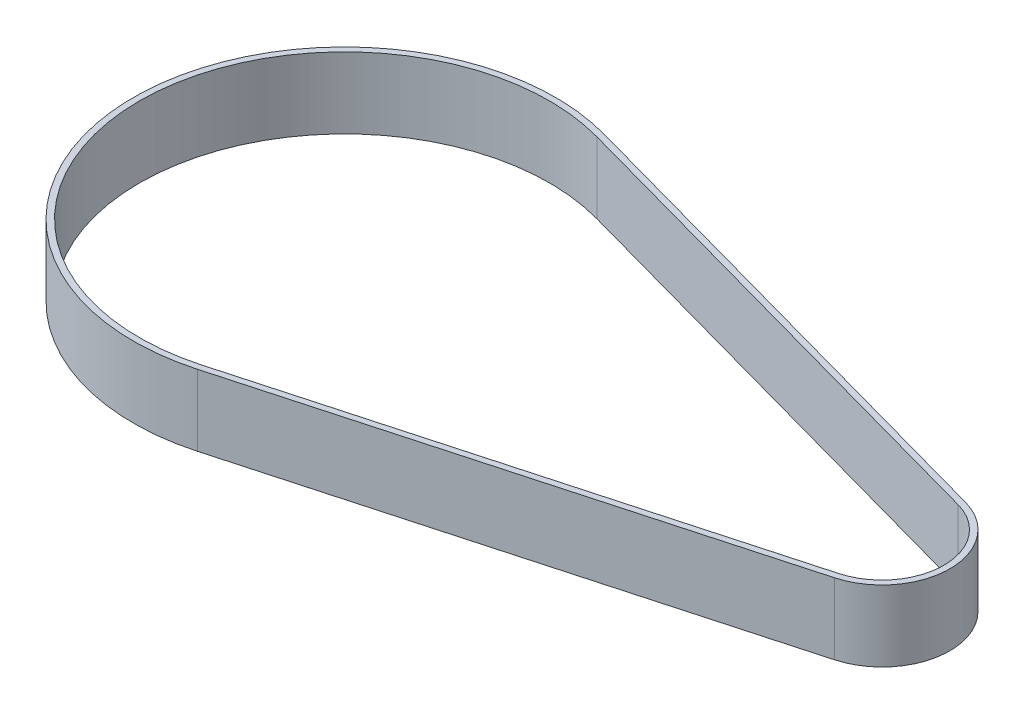
ISO-10303-21;
HEADER;
FILE_DESCRIPTION(('STEP AP214'),'2;1');
FILE_NAME('part.step','',(''),(''),'','','');
FILE_SCHEMA(('AUTOMOTIVE_DESIGN { 1 0 10303 214 1 1 1 1 }'));
ENDSEC;
DATA;
#1=APPLICATION_CONTEXT('core data for automotive mechanical design processes');
#2=APPLICATION_PROTOCOL_DEFINITION('international standard','automotive_design',2000,#1);
#3=PRODUCT_CONTEXT('',#1,'mechanical');
#4=PRODUCT('Part','Part','',(#3));
#5=PRODUCT_RELATED_PRODUCT_CATEGORY('part','',(#4));
#6=PRODUCT_DEFINITION_FORMATION('','',#4);
#7=PRODUCT_DEFINITION_CONTEXT('part definition',#1,'design');
#8=PRODUCT_DEFINITION('design','',#6,#7);
#9=PRODUCT_DEFINITION_SHAPE('','',#8);
#10=(LENGTH_UNIT() NAMED_UNIT(*) SI_UNIT(.MILLI.,.METRE.));
#11=(NAMED_UNIT(*) PLANE_ANGLE_UNIT() SI_UNIT($,.RADIAN.));
#12=(NAMED_UNIT(*) SI_UNIT($,.STERADIAN.) SOLID_ANGLE_UNIT());
#13=UNCERTAINTY_MEASURE_WITH_UNIT(LENGTH_MEASURE(1.E-05),#10,'distance_accuracy_value','');
#14=(GEOMETRIC_REPRESENTATION_CONTEXT(3) GLOBAL_UNCERTAINTY_ASSIGNED_CONTEXT((#13)) GLOBAL_UNIT_ASSIGNED_CONTEXT((#10,
#11,#12)) REPRESENTATION_CONTEXT('',''));
#15=CARTESIAN_POINT('',(0.,0.,0.));
#16=DIRECTION('',(0.,0.,1.));
#17=DIRECTION('',(1.,0.,0.));
#18=AXIS2_PLACEMENT_3D('',#15,#16,#17);
#19=CARTESIAN_POINT('',(11.8754505041929,15.,-42.939710500683));
#20=DIRECTION('',(-0.266436558043237,0.,0.963852457867942));
#21=DIRECTION('',(0.963852457867942,0.,0.266436558043237));
#22=AXIS2_PLACEMENT_3D('',#19,#20,#21);
#23=PLANE('',#22);
#24=DIRECTION('',(0.,-1.,0.));
#25=VECTOR('',#24,1.);
#26=CARTESIAN_POINT('',(11.8754505041929,15.,-42.939710500683));
#27=LINE('',#26,#25);
#28=CARTESIAN_POINT('',(11.8754505041929,15.,-42.939710500683));
#29=VERTEX_POINT('',#28);
#30=CARTESIAN_POINT('',(11.8754505041929,0.,-42.939710500683));
#31=VERTEX_POINT('',#30);
#32=EDGE_CURVE('E98',#29,#31,#27,.T.);
#33=ORIENTED_EDGE('',*,*,#32,.F.);
#34=DIRECTION('',(-0.963852457867942,0.,-0.266436558043237));
#35=VECTOR('',#34,1.);
#36=CARTESIAN_POINT('',(117.262255155904,15.,-13.807764770433));
#37=LINE('',#36,#35);
#38=CARTESIAN_POINT('',(117.262255155904,15.,-13.807764770433));
#39=VERTEX_POINT('',#38);
#40=EDGE_CURVE('E96',#39,#29,#37,.T.);
#41=ORIENTED_EDGE('',*,*,#40,.F.);
#42=DIRECTION('',(0.,-1.,0.));
#43=VECTOR('',#42,1.);
#44=CARTESIAN_POINT('',(117.262255155904,15.,-13.807764770433));
#45=LINE('',#44,#43);
#46=CARTESIAN_POINT('',(117.262255155904,0.,-13.807764770433));
#47=VERTEX_POINT('',#46);
#48=EDGE_CURVE('E83',#47,#39,#45,.F.);
#49=ORIENTED_EDGE('',*,*,#48,.F.);
#50=DIRECTION('',(-0.963852457867942,0.,-0.266436558043237));
#51=VECTOR('',#50,1.);
#52=CARTESIAN_POINT('',(117.262255155904,0.,-13.807764770433));
#53=LINE('',#52,#51);
#54=EDGE_CURVE('E114',#47,#31,#53,.T.);
#55=ORIENTED_EDGE('',*,*,#54,.T.);
#56=EDGE_LOOP('',(#33,#41,#49,#55));
#57=FACE_BOUND('',#56,.T.);
#58=ADVANCED_FACE('F17',(#57),#23,.F.);
#59=CARTESIAN_POINT('',(11.8754505041929,15.,42.939710500683));
#60=DIRECTION('',(-0.266436558043237,0.,-0.963852457867942));
#61=DIRECTION('',(-0.963852457867942,0.,0.266436558043237));
#62=AXIS2_PLACEMENT_3D('',#59,#60,#61);
#63=PLANE('',#62);
#64=DIRECTION('',(0.,-1.,0.));
#65=VECTOR('',#64,1.);
#66=CARTESIAN_POINT('',(117.262255155904,15.,13.807764770433));
#67=LINE('',#66,#65);
#68=CARTESIAN_POINT('',(117.262255155904,15.,13.807764770433));
#69=VERTEX_POINT('',#68);
#70=CARTESIAN_POINT('',(117.262255155904,0.,13.807764770433));
#71=VERTEX_POINT('',#70);
#72=EDGE_CURVE('E78',#69,#71,#67,.T.);
#73=ORIENTED_EDGE('',*,*,#72,.F.);
#74=DIRECTION('',(0.963852457867942,0.,-0.266436558043237));
#75=VECTOR('',#74,1.);
#76=CARTESIAN_POINT('',(11.8754505041929,15.,42.939710500683));
#77=LINE('',#76,#75);
#78=CARTESIAN_POINT('',(11.8754505041929,15.,42.939710500683));
#79=VERTEX_POINT('',#78);
#80=EDGE_CURVE('E100',#79,#69,#77,.T.);
#81=ORIENTED_EDGE('',*,*,#80,.F.);
#82=DIRECTION('',(0.,-1.,0.));
#83=VECTOR('',#82,1.);
#84=CARTESIAN_POINT('',(11.8754505041929,15.,42.939710500683));
#85=LINE('',#84,#83);
#86=CARTESIAN_POINT('',(11.8754505041929,0.,42.939710500683));
#87=VERTEX_POINT('',#86);
#88=EDGE_CURVE('E103',#87,#79,#85,.F.);
#89=ORIENTED_EDGE('',*,*,#88,.F.);
#90=DIRECTION('',(0.963852457867942,0.,-0.266436558043237));
#91=VECTOR('',#90,1.);
#92=CARTESIAN_POINT('',(11.8754505041929,0.,42.939710500683));
#93=LINE('',#92,#91);
#94=EDGE_CURVE('E124',#87,#71,#93,.T.);
#95=ORIENTED_EDGE('',*,*,#94,.T.);
#96=EDGE_LOOP('',(#73,#81,#89,#95));
#97=FACE_BOUND('',#96,.T.);
#98=ADVANCED_FACE('F184',(#97),#63,.F.);
#99=CARTESIAN_POINT('',(113.4453916,15.,0.));
#100=DIRECTION('',(0.,-1.,0.));
#101=DIRECTION('',(0.,0.,-1.));
#102=AXIS2_PLACEMENT_3D('',#99,#100,#101);
#103=CYLINDRICAL_SURFACE('',#102,14.3256);
#104=CARTESIAN_POINT('',(113.4453916,15.,0.));
#105=DIRECTION('',(0.,-1.,0.));
#106=DIRECTION('',(0.,0.,-1.));
#107=AXIS2_PLACEMENT_3D('',#104,#105,#106);
#108=CIRCLE('',#107,14.3256);
#109=EDGE_CURVE('E20',#69,#39,#108,.F.);
#110=ORIENTED_EDGE('',*,*,#109,.F.);
#111=ORIENTED_EDGE('',*,*,#72,.T.);
#112=CARTESIAN_POINT('',(113.4453916,0.,0.));
#113=DIRECTION('',(0.,-1.,0.));
#114=DIRECTION('',(0.,0.,-1.));
#115=AXIS2_PLACEMENT_3D('',#112,#113,#114);
#116=CIRCLE('',#115,14.3256);
#117=EDGE_CURVE('E89',#71,#47,#116,.F.);
#118=ORIENTED_EDGE('',*,*,#117,.T.);
#119=ORIENTED_EDGE('',*,*,#48,.T.);
#120=EDGE_LOOP('',(#110,#111,#118,#119));
#121=FACE_BOUND('',#120,.T.);
#122=ADVANCED_FACE('F85',(#121),#103,.T.);
#123=CARTESIAN_POINT('',(11.5370008824211,15.,-41.7156386696877));
#124=DIRECTION('',(-0.266436558085482,0.,0.963852457856264));
#125=DIRECTION('',(0.963852457856264,0.,0.266436558085482));
#126=AXIS2_PLACEMENT_3D('',#123,#124,#125);
#127=PLANE('',#126);
#128=DIRECTION('',(0.963852457856264,0.,0.266436558085482));
#129=VECTOR('',#128,1.);
#130=CARTESIAN_POINT('',(11.5370008824211,15.,-41.7156386696877));
#131=LINE('',#130,#129);
#132=CARTESIAN_POINT('',(11.5370008824211,15.,-41.7156386696877));
#133=VERTEX_POINT('',#132);
#134=CARTESIAN_POINT('',(116.923880727465,15.,-12.5836721488645));
#135=VERTEX_POINT('',#134);
#136=EDGE_CURVE('E126',#133,#135,#131,.T.);
#137=ORIENTED_EDGE('',*,*,#136,.F.);
#138=DIRECTION('',(0.,-1.,0.));
#139=VECTOR('',#138,1.);
#140=CARTESIAN_POINT('',(11.5370008824211,15.,-41.7156386696877));
#141=LINE('',#140,#139);
#142=CARTESIAN_POINT('',(11.5370008824211,0.,-41.7156386696877));
#143=VERTEX_POINT('',#142);
#144=EDGE_CURVE('E105',#133,#143,#141,.T.);
#145=ORIENTED_EDGE('',*,*,#144,.T.);
#146=DIRECTION('',(0.963852457856264,0.,0.266436558085482));
#147=VECTOR('',#146,1.);
#148=CARTESIAN_POINT('',(11.5370008824211,0.,-41.7156386696877));
#149=LINE('',#148,#147);
#150=CARTESIAN_POINT('',(116.923880727465,0.,-12.5836721488645));
#151=VERTEX_POINT('',#150);
#152=EDGE_CURVE('E122',#143,#151,#149,.T.);
#153=ORIENTED_EDGE('',*,*,#152,.T.);
#154=DIRECTION('',(0.,-1.,0.));
#155=VECTOR('',#154,1.);
#156=CARTESIAN_POINT('',(116.923880727189,15.,-12.5836721489407));
#157=LINE('',#156,#155);
#158=EDGE_CURVE('E144',#151,#135,#157,.F.);
#159=ORIENTED_EDGE('',*,*,#158,.T.);
#160=EDGE_LOOP('',(#137,#145,#153,#159));
#161=FACE_BOUND('',#160,.T.);
#162=ADVANCED_FACE('F159',(#161),#127,.T.);
#163=CARTESIAN_POINT('',(113.4453916,15.,0.));
#164=DIRECTION('',(0.,-1.,0.));
#165=DIRECTION('',(0.,0.,-1.));
#166=AXIS2_PLACEMENT_3D('',#163,#164,#165);
#167=CYLINDRICAL_SURFACE('',#166,13.0556);
#168=DIRECTION('',(0.,1.,0.));
#169=VECTOR('',#168,1.);
#170=CARTESIAN_POINT('',(116.923880727189,15.,12.5836721489407));
#171=LINE('',#170,#169);
#172=CARTESIAN_POINT('',(116.923880727465,15.,12.5836721488645));
#173=VERTEX_POINT('',#172);
#174=CARTESIAN_POINT('',(116.923880727465,0.,12.5836721488645));
#175=VERTEX_POINT('',#174);
#176=EDGE_CURVE('E141',#173,#175,#171,.F.);
#177=ORIENTED_EDGE('',*,*,#176,.F.);
#178=CARTESIAN_POINT('',(113.4453916,15.,0.));
#179=DIRECTION('',(0.,-1.,0.));
#180=DIRECTION('',(0.,0.,-1.));
#181=AXIS2_PLACEMENT_3D('',#178,#179,#180);
#182=CIRCLE('',#181,13.0556);
#183=EDGE_CURVE('E115',#135,#173,#182,.T.);
#184=ORIENTED_EDGE('',*,*,#183,.F.);
#185=ORIENTED_EDGE('',*,*,#158,.F.);
#186=CARTESIAN_POINT('',(113.4453916,0.,0.));
#187=DIRECTION('',(0.,-1.,0.));
#188=DIRECTION('',(0.,0.,-1.));
#189=AXIS2_PLACEMENT_3D('',#186,#187,#188);
#190=CIRCLE('',#189,13.0556);
#191=EDGE_CURVE('E120',#151,#175,#190,.T.);
#192=ORIENTED_EDGE('',*,*,#191,.T.);
#193=EDGE_LOOP('',(#177,#184,#185,#192));
#194=FACE_BOUND('',#193,.T.);
#195=ADVANCED_FACE('F163',(#194),#167,.F.);
#196=CARTESIAN_POINT('',(11.5370008824211,15.,41.7156386696877));
#197=DIRECTION('',(-0.266436558085482,0.,-0.963852457856264));
#198=DIRECTION('',(-0.963852457856264,0.,0.266436558085482));
#199=AXIS2_PLACEMENT_3D('',#196,#197,#198);
#200=PLANE('',#199);
#201=DIRECTION('',(-0.963852457856264,0.,0.266436558085482));
#202=VECTOR('',#201,1.);
#203=CARTESIAN_POINT('',(116.923880727189,15.,12.5836721489407));
#204=LINE('',#203,#202);
#205=CARTESIAN_POINT('',(11.5370008824211,15.,41.7156386696877));
#206=VERTEX_POINT('',#205);
#207=EDGE_CURVE('E129',#173,#206,#204,.T.);
#208=ORIENTED_EDGE('',*,*,#207,.F.);
#209=ORIENTED_EDGE('',*,*,#176,.T.);
#210=DIRECTION('',(-0.963852457856264,0.,0.266436558085482));
#211=VECTOR('',#210,1.);
#212=CARTESIAN_POINT('',(116.923880727189,0.,12.5836721489407));
#213=LINE('',#212,#211);
#214=CARTESIAN_POINT('',(11.5370008824211,0.,41.7156386696877));
#215=VERTEX_POINT('',#214);
#216=EDGE_CURVE('E119',#175,#215,#213,.T.);
#217=ORIENTED_EDGE('',*,*,#216,.T.);
#218=DIRECTION('',(0.,-1.,0.));
#219=VECTOR('',#218,1.);
#220=CARTESIAN_POINT('',(11.5370008824211,15.,41.7156386696877));
#221=LINE('',#220,#219);
#222=EDGE_CURVE('E110',#215,#206,#221,.F.);
#223=ORIENTED_EDGE('',*,*,#222,.T.);
#224=EDGE_LOOP('',(#208,#209,#217,#223));
#225=FACE_BOUND('',#224,.T.);
#226=ADVANCED_FACE('F153',(#225),#200,.T.);
#227=CARTESIAN_POINT('',(0.,15.,0.));
#228=DIRECTION('',(0.,-1.,0.));
#229=DIRECTION('',(0.,0.,-1.));
#230=AXIS2_PLACEMENT_3D('',#227,#228,#229);
#231=CYLINDRICAL_SURFACE('',#230,43.2816000048626);
#232=CARTESIAN_POINT('',(0.,15.,0.));
#233=DIRECTION('',(0.,-1.,0.));
#234=DIRECTION('',(0.,0.,-1.));
#235=AXIS2_PLACEMENT_3D('',#232,#233,#234);
#236=CIRCLE('',#235,43.2816000048626);
#237=EDGE_CURVE('E127',#206,#133,#236,.T.);
#238=ORIENTED_EDGE('',*,*,#237,.F.);
#239=ORIENTED_EDGE('',*,*,#222,.F.);
#240=CARTESIAN_POINT('',(0.,0.,0.));
#241=DIRECTION('',(0.,-1.,0.));
#242=DIRECTION('',(0.,0.,-1.));
#243=AXIS2_PLACEMENT_3D('',#240,#241,#242);
#244=CIRCLE('',#243,43.2816000048626);
#245=EDGE_CURVE('E35',#215,#143,#244,.T.);
#246=ORIENTED_EDGE('',*,*,#245,.T.);
#247=ORIENTED_EDGE('',*,*,#144,.F.);
#248=EDGE_LOOP('',(#238,#239,#246,#247));
#249=FACE_BOUND('',#248,.T.);
#250=ADVANCED_FACE('F156',(#249),#231,.F.);
#251=CARTESIAN_POINT('',(113.4453916,15.,0.));
#252=DIRECTION('',(0.,1.,0.));
#253=DIRECTION('',(0.,0.,1.));
#254=AXIS2_PLACEMENT_3D('',#251,#252,#253);
#255=PLANE('',#254);
#256=ORIENTED_EDGE('',*,*,#136,.T.);
#257=ORIENTED_EDGE('',*,*,#183,.T.);
#258=ORIENTED_EDGE('',*,*,#207,.T.);
#259=ORIENTED_EDGE('',*,*,#237,.T.);
#260=EDGE_LOOP('',(#256,#257,#258,#259));
#261=FACE_BOUND('',#260,.T.);
#262=CARTESIAN_POINT('',(0.,15.,0.));
#263=DIRECTION('',(0.,-1.,0.));
#264=DIRECTION('',(0.,0.,-1.));
#265=AXIS2_PLACEMENT_3D('',#262,#263,#264);
#266=CIRCLE('',#265,44.5516);
#267=EDGE_CURVE('E26',#79,#29,#266,.T.);
#268=ORIENTED_EDGE('',*,*,#267,.F.);
#269=ORIENTED_EDGE('',*,*,#80,.T.);
#270=ORIENTED_EDGE('',*,*,#109,.T.);
#271=ORIENTED_EDGE('',*,*,#40,.T.);
#272=EDGE_LOOP('',(#268,#269,#270,#271));
#273=FACE_BOUND('',#272,.T.);
#274=ADVANCED_FACE('F102',(#261,#273),#255,.T.);
#275=CARTESIAN_POINT('',(113.4453916,0.,0.));
#276=DIRECTION('',(0.,1.,0.));
#277=DIRECTION('',(0.,0.,1.));
#278=AXIS2_PLACEMENT_3D('',#275,#276,#277);
#279=PLANE('',#278);
#280=ORIENTED_EDGE('',*,*,#245,.F.);
#281=ORIENTED_EDGE('',*,*,#216,.F.);
#282=ORIENTED_EDGE('',*,*,#191,.F.);
#283=ORIENTED_EDGE('',*,*,#152,.F.);
#284=EDGE_LOOP('',(#280,#281,#282,#283));
#285=FACE_BOUND('',#284,.T.);
#286=ORIENTED_EDGE('',*,*,#94,.F.);
#287=CARTESIAN_POINT('',(0.,0.,0.));
#288=DIRECTION('',(0.,-1.,0.));
#289=DIRECTION('',(0.,0.,-1.));
#290=AXIS2_PLACEMENT_3D('',#287,#288,#289);
#291=CIRCLE('',#290,44.5516);
#292=EDGE_CURVE('E11',#31,#87,#291,.F.);
#293=ORIENTED_EDGE('',*,*,#292,.F.);
#294=ORIENTED_EDGE('',*,*,#54,.F.);
#295=ORIENTED_EDGE('',*,*,#117,.F.);
#296=EDGE_LOOP('',(#286,#293,#294,#295));
#297=FACE_BOUND('',#296,.T.);
#298=ADVANCED_FACE('F147',(#285,#297),#279,.F.);
#299=CARTESIAN_POINT('',(0.,15.,0.));
#300=DIRECTION('',(0.,-1.,0.));
#301=DIRECTION('',(0.,0.,-1.));
#302=AXIS2_PLACEMENT_3D('',#299,#300,#301);
#303=CYLINDRICAL_SURFACE('',#302,44.5516);
#304=ORIENTED_EDGE('',*,*,#267,.T.);
#305=ORIENTED_EDGE('',*,*,#32,.T.);
#306=ORIENTED_EDGE('',*,*,#292,.T.);
#307=ORIENTED_EDGE('',*,*,#88,.T.);
#308=EDGE_LOOP('',(#304,#305,#306,#307));
#309=FACE_BOUND('',#308,.T.);
#310=ADVANCED_FACE('F165',(#309),#303,.T.);
#311=CLOSED_SHELL('',(#58,#98,#122,#162,#195,#226,#250,#274,#298,#310));
#312=MANIFOLD_SOLID_BREP('B1',#311);
#313=ADVANCED_BREP_SHAPE_REPRESENTATION('',(#18,#312),#14);
#314=SHAPE_DEFINITION_REPRESENTATION(#9,#313);
ENDSEC;
END-ISO-10303-21;
